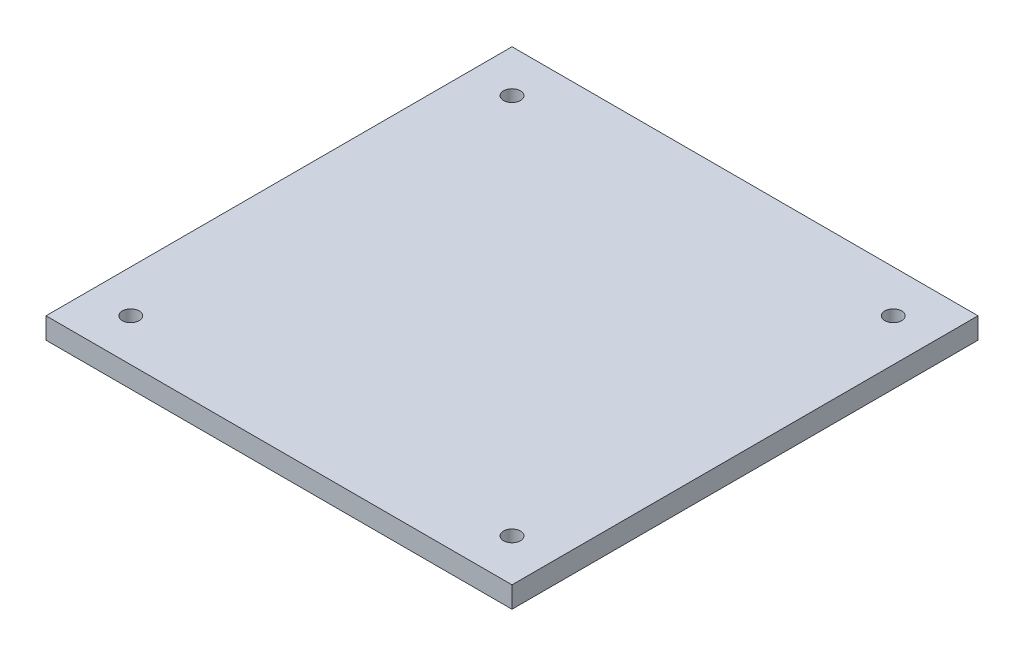
ISO-10303-21;
HEADER;
FILE_DESCRIPTION(('STEP AP214'),'2;1');
FILE_NAME('part.step','',(''),(''),'','','');
FILE_SCHEMA(('AUTOMOTIVE_DESIGN { 1 0 10303 214 1 1 1 1 }'));
ENDSEC;
DATA;
#1=APPLICATION_CONTEXT('core data for automotive mechanical design processes');
#2=APPLICATION_PROTOCOL_DEFINITION('international standard','automotive_design',2000,#1);
#3=PRODUCT_CONTEXT('',#1,'mechanical');
#4=PRODUCT('Part','Part','',(#3));
#5=PRODUCT_RELATED_PRODUCT_CATEGORY('part','',(#4));
#6=PRODUCT_DEFINITION_FORMATION('','',#4);
#7=PRODUCT_DEFINITION_CONTEXT('part definition',#1,'design');
#8=PRODUCT_DEFINITION('design','',#6,#7);
#9=PRODUCT_DEFINITION_SHAPE('','',#8);
#10=(LENGTH_UNIT() NAMED_UNIT(*) SI_UNIT(.MILLI.,.METRE.));
#11=(NAMED_UNIT(*) PLANE_ANGLE_UNIT() SI_UNIT($,.RADIAN.));
#12=(NAMED_UNIT(*) SI_UNIT($,.STERADIAN.) SOLID_ANGLE_UNIT());
#13=UNCERTAINTY_MEASURE_WITH_UNIT(LENGTH_MEASURE(1.E-05),#10,'distance_accuracy_value','');
#14=(GEOMETRIC_REPRESENTATION_CONTEXT(3) GLOBAL_UNCERTAINTY_ASSIGNED_CONTEXT((#13)) GLOBAL_UNIT_ASSIGNED_CONTEXT((#10,
#11,#12)) REPRESENTATION_CONTEXT('',''));
#15=CARTESIAN_POINT('',(0.,0.,0.));
#16=DIRECTION('',(0.,0.,1.));
#17=DIRECTION('',(1.,0.,0.));
#18=AXIS2_PLACEMENT_3D('',#15,#16,#17);
#19=CARTESIAN_POINT('',(-98.2758620689655,10.,57.7155172413792));
#20=DIRECTION('',(1.,0.,0.));
#21=DIRECTION('',(0.,0.,-1.));
#22=AXIS2_PLACEMENT_3D('',#19,#20,#21);
#23=PLANE('',#22);
#24=DIRECTION('',(0.,0.,1.));
#25=VECTOR('',#24,1.);
#26=CARTESIAN_POINT('',(-98.2758620689655,0.,57.7155172413792));
#27=LINE('',#26,#25);
#28=CARTESIAN_POINT('',(-98.2758620689655,0.,-162.284482758621));
#29=VERTEX_POINT('',#28);
#30=CARTESIAN_POINT('',(-98.2758620689655,0.,57.7155172413792));
#31=VERTEX_POINT('',#30);
#32=EDGE_CURVE('E96',#29,#31,#27,.T.);
#33=ORIENTED_EDGE('',*,*,#32,.T.);
#34=DIRECTION('',(0.,-1.,0.));
#35=VECTOR('',#34,1.);
#36=CARTESIAN_POINT('',(-98.2758620689655,10.,57.7155172413792));
#37=LINE('',#36,#35);
#38=CARTESIAN_POINT('',(-98.2758620689655,10.,57.7155172413792));
#39=VERTEX_POINT('',#38);
#40=EDGE_CURVE('E11',#39,#31,#37,.T.);
#41=ORIENTED_EDGE('',*,*,#40,.F.);
#42=DIRECTION('',(0.,0.,1.));
#43=VECTOR('',#42,1.);
#44=CARTESIAN_POINT('',(-98.2758620689655,10.,57.7155172413792));
#45=LINE('',#44,#43);
#46=CARTESIAN_POINT('',(-98.2758620689655,10.,-162.284482758621));
#47=VERTEX_POINT('',#46);
#48=EDGE_CURVE('E84',#47,#39,#45,.T.);
#49=ORIENTED_EDGE('',*,*,#48,.F.);
#50=DIRECTION('',(0.,-1.,0.));
#51=VECTOR('',#50,1.);
#52=CARTESIAN_POINT('',(-98.2758620689655,10.,-162.284482758621));
#53=LINE('',#52,#51);
#54=EDGE_CURVE('E92',#47,#29,#53,.T.);
#55=ORIENTED_EDGE('',*,*,#54,.T.);
#56=EDGE_LOOP('',(#33,#41,#49,#55));
#57=FACE_BOUND('',#56,.T.);
#58=ADVANCED_FACE('F33',(#57),#23,.F.);
#59=CARTESIAN_POINT('',(-98.2758620689655,10.,57.7155172413792));
#60=DIRECTION('',(0.,0.,-1.));
#61=DIRECTION('',(-1.,0.,0.));
#62=AXIS2_PLACEMENT_3D('',#59,#60,#61);
#63=PLANE('',#62);
#64=DIRECTION('',(1.,0.,0.));
#65=VECTOR('',#64,1.);
#66=CARTESIAN_POINT('',(-98.2758620689655,0.,57.7155172413792));
#67=LINE('',#66,#65);
#68=CARTESIAN_POINT('',(121.724137931034,0.,57.7155172413792));
#69=VERTEX_POINT('',#68);
#70=EDGE_CURVE('E88',#31,#69,#67,.T.);
#71=ORIENTED_EDGE('',*,*,#70,.T.);
#72=DIRECTION('',(0.,-1.,0.));
#73=VECTOR('',#72,1.);
#74=CARTESIAN_POINT('',(121.724137931034,10.,57.7155172413792));
#75=LINE('',#74,#73);
#76=CARTESIAN_POINT('',(121.724137931034,10.,57.7155172413792));
#77=VERTEX_POINT('',#76);
#78=EDGE_CURVE('E41',#77,#69,#75,.T.);
#79=ORIENTED_EDGE('',*,*,#78,.F.);
#80=DIRECTION('',(1.,0.,0.));
#81=VECTOR('',#80,1.);
#82=CARTESIAN_POINT('',(-98.2758620689655,10.,57.7155172413792));
#83=LINE('',#82,#81);
#84=EDGE_CURVE('E79',#39,#77,#83,.T.);
#85=ORIENTED_EDGE('',*,*,#84,.F.);
#86=ORIENTED_EDGE('',*,*,#40,.T.);
#87=EDGE_LOOP('',(#71,#79,#85,#86));
#88=FACE_BOUND('',#87,.T.);
#89=ADVANCED_FACE('F87',(#88),#63,.F.);
#90=CARTESIAN_POINT('',(121.724137931034,10.,57.7155172413792));
#91=DIRECTION('',(-1.,0.,0.));
#92=DIRECTION('',(0.,0.,1.));
#93=AXIS2_PLACEMENT_3D('',#90,#91,#92);
#94=PLANE('',#93);
#95=DIRECTION('',(0.,0.,-1.));
#96=VECTOR('',#95,1.);
#97=CARTESIAN_POINT('',(121.724137931034,0.,57.7155172413792));
#98=LINE('',#97,#96);
#99=CARTESIAN_POINT('',(121.724137931034,0.,-162.284482758621));
#100=VERTEX_POINT('',#99);
#101=EDGE_CURVE('E66',#69,#100,#98,.T.);
#102=ORIENTED_EDGE('',*,*,#101,.T.);
#103=DIRECTION('',(0.,-1.,0.));
#104=VECTOR('',#103,1.);
#105=CARTESIAN_POINT('',(121.724137931034,10.,-162.284482758621));
#106=LINE('',#105,#104);
#107=CARTESIAN_POINT('',(121.724137931034,10.,-162.284482758621));
#108=VERTEX_POINT('',#107);
#109=EDGE_CURVE('E89',#108,#100,#106,.T.);
#110=ORIENTED_EDGE('',*,*,#109,.F.);
#111=DIRECTION('',(0.,0.,-1.));
#112=VECTOR('',#111,1.);
#113=CARTESIAN_POINT('',(121.724137931034,10.,57.7155172413792));
#114=LINE('',#113,#112);
#115=EDGE_CURVE('E82',#77,#108,#114,.T.);
#116=ORIENTED_EDGE('',*,*,#115,.F.);
#117=ORIENTED_EDGE('',*,*,#78,.T.);
#118=EDGE_LOOP('',(#102,#110,#116,#117));
#119=FACE_BOUND('',#118,.T.);
#120=ADVANCED_FACE('F90',(#119),#94,.F.);
#121=CARTESIAN_POINT('',(-98.2758620689655,10.,-162.284482758621));
#122=DIRECTION('',(0.,0.,1.));
#123=DIRECTION('',(1.,0.,0.));
#124=AXIS2_PLACEMENT_3D('',#121,#122,#123);
#125=PLANE('',#124);
#126=DIRECTION('',(-1.,0.,0.));
#127=VECTOR('',#126,1.);
#128=CARTESIAN_POINT('',(-98.2758620689655,0.,-162.284482758621));
#129=LINE('',#128,#127);
#130=EDGE_CURVE('E72',#100,#29,#129,.T.);
#131=ORIENTED_EDGE('',*,*,#130,.T.);
#132=ORIENTED_EDGE('',*,*,#54,.F.);
#133=DIRECTION('',(-1.,0.,0.));
#134=VECTOR('',#133,1.);
#135=CARTESIAN_POINT('',(-98.2758620689655,10.,-162.284482758621));
#136=LINE('',#135,#134);
#137=EDGE_CURVE('E49',#108,#47,#136,.T.);
#138=ORIENTED_EDGE('',*,*,#137,.F.);
#139=ORIENTED_EDGE('',*,*,#109,.T.);
#140=EDGE_LOOP('',(#131,#132,#138,#139));
#141=FACE_BOUND('',#140,.T.);
#142=ADVANCED_FACE('F104',(#141),#125,.F.);
#143=CARTESIAN_POINT('',(0.,10.,0.));
#144=DIRECTION('',(0.,-1.,0.));
#145=DIRECTION('',(0.,0.,-1.));
#146=AXIS2_PLACEMENT_3D('',#143,#144,#145);
#147=PLANE('',#146);
#148=CARTESIAN_POINT('',(-78.2758620689655,10.,37.7155172413793));
#149=DIRECTION('',(0.,1.,0.));
#150=DIRECTION('',(0.,0.,-1.));
#151=AXIS2_PLACEMENT_3D('',#148,#149,#150);
#152=CIRCLE('',#151,4.00000000000001);
#153=CARTESIAN_POINT('',(-78.2758620689655,10.,33.7155172413793));
#154=VERTEX_POINT('',#153);
#155=EDGE_CURVE('E116',#154,#154,#152,.T.);
#156=ORIENTED_EDGE('',*,*,#155,.F.);
#157=EDGE_LOOP('',(#156));
#158=FACE_BOUND('',#157,.T.);
#159=CARTESIAN_POINT('',(101.724137931035,10.,37.7155172413793));
#160=DIRECTION('',(0.,1.,0.));
#161=DIRECTION('',(0.,0.,1.));
#162=AXIS2_PLACEMENT_3D('',#159,#160,#161);
#163=CIRCLE('',#162,3.99999999999996);
#164=CARTESIAN_POINT('',(101.724137931035,10.,41.7155172413792));
#165=VERTEX_POINT('',#164);
#166=EDGE_CURVE('E122',#165,#165,#163,.T.);
#167=ORIENTED_EDGE('',*,*,#166,.F.);
#168=EDGE_LOOP('',(#167));
#169=FACE_BOUND('',#168,.T.);
#170=CARTESIAN_POINT('',(101.724137931034,10.,-142.284482758621));
#171=DIRECTION('',(0.,1.,0.));
#172=DIRECTION('',(0.,0.,-1.));
#173=AXIS2_PLACEMENT_3D('',#170,#171,#172);
#174=CIRCLE('',#173,3.99999999999996);
#175=CARTESIAN_POINT('',(101.724137931034,10.,-146.284482758621));
#176=VERTEX_POINT('',#175);
#177=EDGE_CURVE('E128',#176,#176,#174,.T.);
#178=ORIENTED_EDGE('',*,*,#177,.F.);
#179=EDGE_LOOP('',(#178));
#180=FACE_BOUND('',#179,.T.);
#181=CARTESIAN_POINT('',(-78.2758620689655,10.,-142.284482758621));
#182=DIRECTION('',(0.,1.,0.));
#183=DIRECTION('',(0.,0.,1.));
#184=AXIS2_PLACEMENT_3D('',#181,#182,#183);
#185=CIRCLE('',#184,4.00000000000001);
#186=CARTESIAN_POINT('',(-78.2758620689655,10.,-138.284482758621));
#187=VERTEX_POINT('',#186);
#188=EDGE_CURVE('E110',#187,#187,#185,.T.);
#189=ORIENTED_EDGE('',*,*,#188,.F.);
#190=EDGE_LOOP('',(#189));
#191=FACE_BOUND('',#190,.T.);
#192=ORIENTED_EDGE('',*,*,#48,.T.);
#193=ORIENTED_EDGE('',*,*,#84,.T.);
#194=ORIENTED_EDGE('',*,*,#115,.T.);
#195=ORIENTED_EDGE('',*,*,#137,.T.);
#196=EDGE_LOOP('',(#192,#193,#194,#195));
#197=FACE_BOUND('',#196,.T.);
#198=ADVANCED_FACE('F80',(#158,#169,#180,#191,#197),#147,.F.);
#199=CARTESIAN_POINT('',(0.,0.,0.));
#200=DIRECTION('',(0.,-1.,0.));
#201=DIRECTION('',(0.,0.,-1.));
#202=AXIS2_PLACEMENT_3D('',#199,#200,#201);
#203=PLANE('',#202);
#204=CARTESIAN_POINT('',(-78.2758620689655,0.,37.7155172413793));
#205=DIRECTION('',(0.,1.,0.));
#206=DIRECTION('',(0.,0.,-1.));
#207=AXIS2_PLACEMENT_3D('',#204,#205,#206);
#208=CIRCLE('',#207,4.00000000000001);
#209=CARTESIAN_POINT('',(-78.2758620689655,0.,33.7155172413793));
#210=VERTEX_POINT('',#209);
#211=EDGE_CURVE('E119',#210,#210,#208,.T.);
#212=ORIENTED_EDGE('',*,*,#211,.T.);
#213=EDGE_LOOP('',(#212));
#214=FACE_BOUND('',#213,.T.);
#215=CARTESIAN_POINT('',(101.724137931035,0.,37.7155172413793));
#216=DIRECTION('',(0.,1.,0.));
#217=DIRECTION('',(0.,0.,1.));
#218=AXIS2_PLACEMENT_3D('',#215,#216,#217);
#219=CIRCLE('',#218,3.99999999999996);
#220=CARTESIAN_POINT('',(101.724137931035,0.,41.7155172413792));
#221=VERTEX_POINT('',#220);
#222=EDGE_CURVE('E125',#221,#221,#219,.T.);
#223=ORIENTED_EDGE('',*,*,#222,.T.);
#224=EDGE_LOOP('',(#223));
#225=FACE_BOUND('',#224,.T.);
#226=CARTESIAN_POINT('',(101.724137931034,0.,-142.284482758621));
#227=DIRECTION('',(0.,1.,0.));
#228=DIRECTION('',(0.,0.,-1.));
#229=AXIS2_PLACEMENT_3D('',#226,#227,#228);
#230=CIRCLE('',#229,3.99999999999996);
#231=CARTESIAN_POINT('',(101.724137931034,0.,-146.284482758621));
#232=VERTEX_POINT('',#231);
#233=EDGE_CURVE('E113',#232,#232,#230,.T.);
#234=ORIENTED_EDGE('',*,*,#233,.T.);
#235=EDGE_LOOP('',(#234));
#236=FACE_BOUND('',#235,.T.);
#237=CARTESIAN_POINT('',(-78.2758620689655,0.,-142.284482758621));
#238=DIRECTION('',(0.,1.,0.));
#239=DIRECTION('',(0.,0.,1.));
#240=AXIS2_PLACEMENT_3D('',#237,#238,#239);
#241=CIRCLE('',#240,4.00000000000001);
#242=CARTESIAN_POINT('',(-78.2758620689655,0.,-138.284482758621));
#243=VERTEX_POINT('',#242);
#244=EDGE_CURVE('E99',#243,#243,#241,.T.);
#245=ORIENTED_EDGE('',*,*,#244,.T.);
#246=EDGE_LOOP('',(#245));
#247=FACE_BOUND('',#246,.T.);
#248=ORIENTED_EDGE('',*,*,#32,.F.);
#249=ORIENTED_EDGE('',*,*,#130,.F.);
#250=ORIENTED_EDGE('',*,*,#101,.F.);
#251=ORIENTED_EDGE('',*,*,#70,.F.);
#252=EDGE_LOOP('',(#248,#249,#250,#251));
#253=FACE_BOUND('',#252,.T.);
#254=ADVANCED_FACE('F107',(#214,#225,#236,#247,#253),#203,.T.);
#255=CARTESIAN_POINT('',(-78.2758620689655,0.,-142.284482758621));
#256=DIRECTION('',(0.,1.,0.));
#257=DIRECTION('',(0.,0.,1.));
#258=AXIS2_PLACEMENT_3D('',#255,#256,#257);
#259=CYLINDRICAL_SURFACE('',#258,4.00000000000001);
#260=ORIENTED_EDGE('',*,*,#244,.F.);
#261=EDGE_LOOP('',(#260));
#262=FACE_BOUND('',#261,.T.);
#263=ORIENTED_EDGE('',*,*,#188,.T.);
#264=EDGE_LOOP('',(#263));
#265=FACE_BOUND('',#264,.T.);
#266=ADVANCED_FACE('F140',(#262,#265),#259,.F.);
#267=CARTESIAN_POINT('',(101.724137931034,0.,-142.284482758621));
#268=DIRECTION('',(0.,1.,0.));
#269=DIRECTION('',(0.,0.,1.));
#270=AXIS2_PLACEMENT_3D('',#267,#268,#269);
#271=CYLINDRICAL_SURFACE('',#270,3.99999999999996);
#272=ORIENTED_EDGE('',*,*,#233,.F.);
#273=EDGE_LOOP('',(#272));
#274=FACE_BOUND('',#273,.T.);
#275=ORIENTED_EDGE('',*,*,#177,.T.);
#276=EDGE_LOOP('',(#275));
#277=FACE_BOUND('',#276,.T.);
#278=ADVANCED_FACE('F136',(#274,#277),#271,.F.);
#279=CARTESIAN_POINT('',(101.724137931035,0.,37.7155172413793));
#280=DIRECTION('',(0.,1.,0.));
#281=DIRECTION('',(0.,0.,1.));
#282=AXIS2_PLACEMENT_3D('',#279,#280,#281);
#283=CYLINDRICAL_SURFACE('',#282,3.99999999999996);
#284=ORIENTED_EDGE('',*,*,#222,.F.);
#285=EDGE_LOOP('',(#284));
#286=FACE_BOUND('',#285,.T.);
#287=ORIENTED_EDGE('',*,*,#166,.T.);
#288=EDGE_LOOP('',(#287));
#289=FACE_BOUND('',#288,.T.);
#290=ADVANCED_FACE('F139',(#286,#289),#283,.F.);
#291=CARTESIAN_POINT('',(-78.2758620689655,0.,37.7155172413793));
#292=DIRECTION('',(0.,1.,0.));
#293=DIRECTION('',(0.,0.,1.));
#294=AXIS2_PLACEMENT_3D('',#291,#292,#293);
#295=CYLINDRICAL_SURFACE('',#294,4.00000000000001);
#296=ORIENTED_EDGE('',*,*,#211,.F.);
#297=EDGE_LOOP('',(#296));
#298=FACE_BOUND('',#297,.T.);
#299=ORIENTED_EDGE('',*,*,#155,.T.);
#300=EDGE_LOOP('',(#299));
#301=FACE_BOUND('',#300,.T.);
#302=ADVANCED_FACE('F201',(#298,#301),#295,.F.);
#303=CLOSED_SHELL('',(#58,#89,#120,#142,#198,#254,#266,#278,#290,#302));
#304=MANIFOLD_SOLID_BREP('B2',#303);
#305=ADVANCED_BREP_SHAPE_REPRESENTATION('',(#18,#304),#14);
#306=SHAPE_DEFINITION_REPRESENTATION(#9,#305);
ENDSEC;
END-ISO-10303-21;
